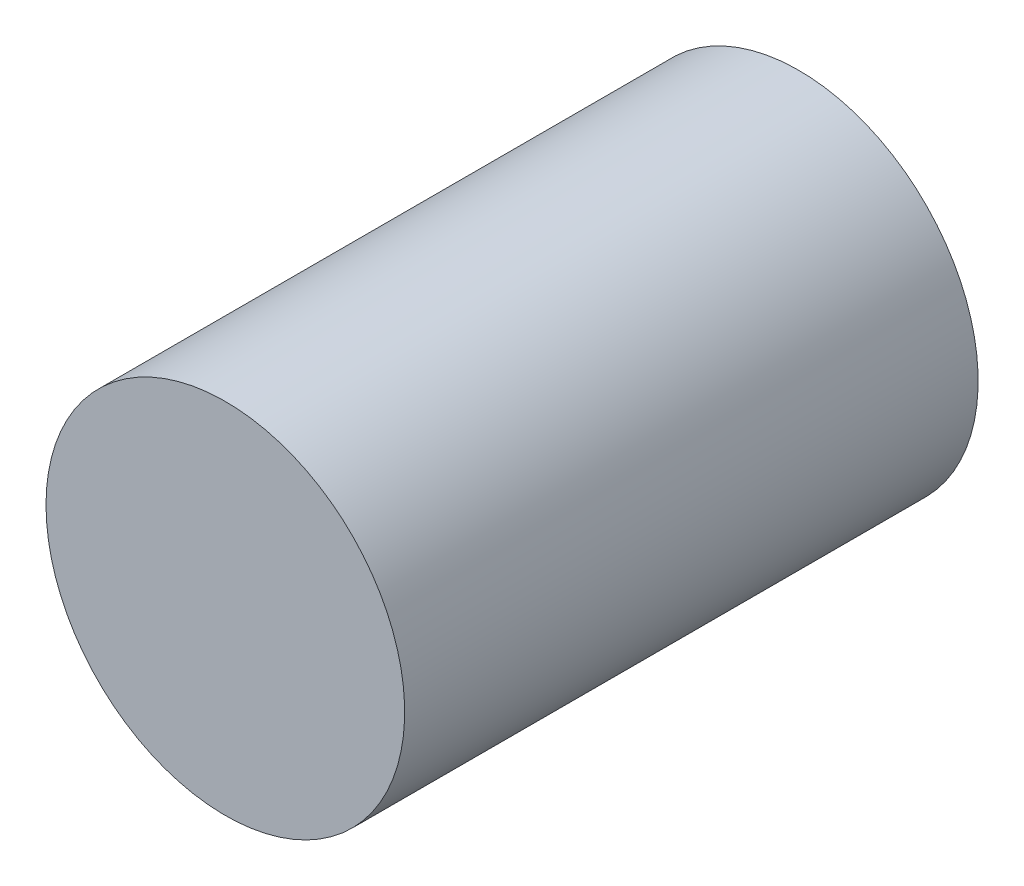
ISO-10303-21;
HEADER;
FILE_DESCRIPTION(('STEP AP214'),'2;1');
FILE_NAME('part.step','',(''),(''),'','','');
FILE_SCHEMA(('AUTOMOTIVE_DESIGN { 1 0 10303 214 1 1 1 1 }'));
ENDSEC;
DATA;
#1=APPLICATION_CONTEXT('core data for automotive mechanical design processes');
#2=APPLICATION_PROTOCOL_DEFINITION('international standard','automotive_design',2000,#1);
#3=PRODUCT_CONTEXT('',#1,'mechanical');
#4=PRODUCT('Part','Part','',(#3));
#5=PRODUCT_RELATED_PRODUCT_CATEGORY('part','',(#4));
#6=PRODUCT_DEFINITION_FORMATION('','',#4);
#7=PRODUCT_DEFINITION_CONTEXT('part definition',#1,'design');
#8=PRODUCT_DEFINITION('design','',#6,#7);
#9=PRODUCT_DEFINITION_SHAPE('','',#8);
#10=(LENGTH_UNIT() NAMED_UNIT(*) SI_UNIT(.MILLI.,.METRE.));
#11=(NAMED_UNIT(*) PLANE_ANGLE_UNIT() SI_UNIT($,.RADIAN.));
#12=(NAMED_UNIT(*) SI_UNIT($,.STERADIAN.) SOLID_ANGLE_UNIT());
#13=UNCERTAINTY_MEASURE_WITH_UNIT(LENGTH_MEASURE(1.E-05),#10,'distance_accuracy_value','');
#14=(GEOMETRIC_REPRESENTATION_CONTEXT(3) GLOBAL_UNCERTAINTY_ASSIGNED_CONTEXT((#13)) GLOBAL_UNIT_ASSIGNED_CONTEXT((#10,
#11,#12)) REPRESENTATION_CONTEXT('',''));
#15=CARTESIAN_POINT('',(0.,0.,0.));
#16=DIRECTION('',(0.,0.,1.));
#17=DIRECTION('',(1.,0.,0.));
#18=AXIS2_PLACEMENT_3D('',#15,#16,#17);
#19=CARTESIAN_POINT('',(4.29999902,0.,0.));
#20=DIRECTION('',(0.,0.,-1.));
#21=DIRECTION('',(-1.,0.,0.));
#22=AXIS2_PLACEMENT_3D('',#19,#20,#21);
#23=PLANE('',#22);
#24=CARTESIAN_POINT('',(0.,0.,0.));
#25=DIRECTION('',(0.,0.,-1.));
#26=DIRECTION('',(-1.,0.,0.));
#27=AXIS2_PLACEMENT_3D('',#24,#25,#26);
#28=CIRCLE('',#27,4.29999902);
#29=CARTESIAN_POINT('',(-4.29999902,0.,0.));
#30=VERTEX_POINT('',#29);
#31=EDGE_CURVE('E18',#30,#30,#28,.F.);
#32=ORIENTED_EDGE('',*,*,#31,.F.);
#33=EDGE_LOOP('',(#32));
#34=FACE_BOUND('',#33,.T.);
#35=ADVANCED_FACE('F15',(#34),#23,.T.);
#36=CARTESIAN_POINT('',(4.29999902,0.,13.75000044));
#37=DIRECTION('',(0.,0.,-1.));
#38=DIRECTION('',(-1.,0.,0.));
#39=AXIS2_PLACEMENT_3D('',#36,#37,#38);
#40=PLANE('',#39);
#41=CARTESIAN_POINT('',(0.,0.,13.75000044));
#42=DIRECTION('',(0.,0.,-1.));
#43=DIRECTION('',(-1.,0.,0.));
#44=AXIS2_PLACEMENT_3D('',#41,#42,#43);
#45=CIRCLE('',#44,4.29999902);
#46=CARTESIAN_POINT('',(-4.29999902,0.,13.75000044));
#47=VERTEX_POINT('',#46);
#48=EDGE_CURVE('E10',#47,#47,#45,.T.);
#49=ORIENTED_EDGE('',*,*,#48,.F.);
#50=EDGE_LOOP('',(#49));
#51=FACE_BOUND('',#50,.T.);
#52=ADVANCED_FACE('F30',(#51),#40,.F.);
#53=CARTESIAN_POINT('',(0.,0.,0.));
#54=DIRECTION('',(0.,0.,-1.));
#55=DIRECTION('',(-1.,0.,0.));
#56=AXIS2_PLACEMENT_3D('',#53,#54,#55);
#57=CYLINDRICAL_SURFACE('',#56,4.29999902);
#58=ORIENTED_EDGE('',*,*,#31,.T.);
#59=EDGE_LOOP('',(#58));
#60=FACE_BOUND('',#59,.T.);
#61=ORIENTED_EDGE('',*,*,#48,.T.);
#62=EDGE_LOOP('',(#61));
#63=FACE_BOUND('',#62,.T.);
#64=ADVANCED_FACE('F27',(#60,#63),#57,.T.);
#65=CLOSED_SHELL('',(#35,#52,#64));
#66=MANIFOLD_SOLID_BREP('B1',#65);
#67=ADVANCED_BREP_SHAPE_REPRESENTATION('',(#18,#66),#14);
#68=SHAPE_DEFINITION_REPRESENTATION(#9,#67);
ENDSEC;
END-ISO-10303-21;
